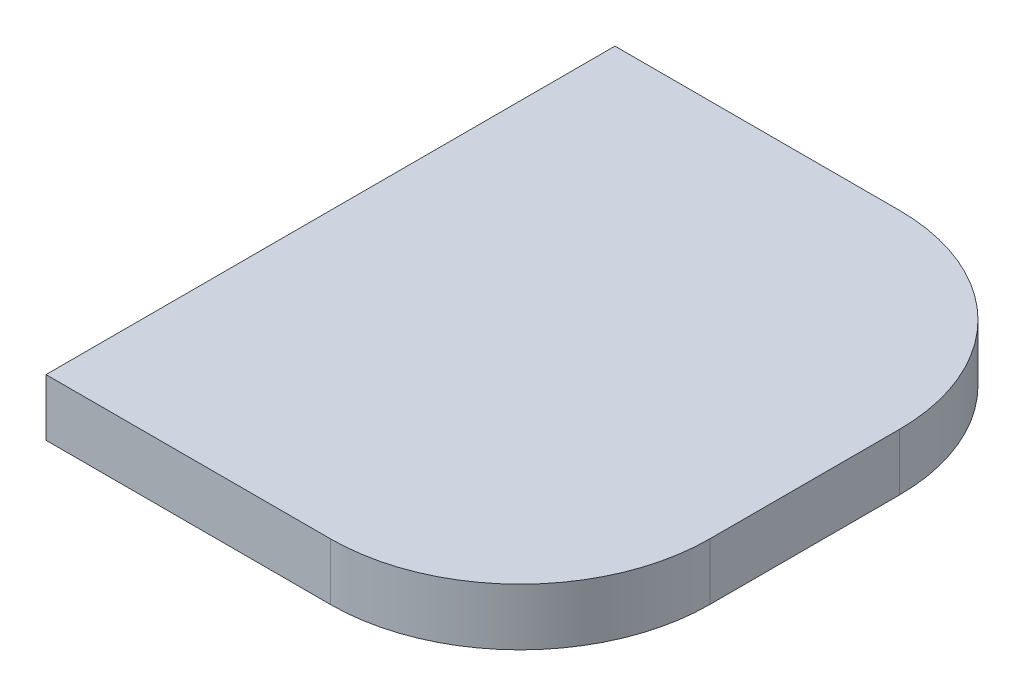
ISO-10303-21;
HEADER;
FILE_DESCRIPTION(('STEP AP214'),'2;1');
FILE_NAME('part.step','',(''),(''),'','','');
FILE_SCHEMA(('AUTOMOTIVE_DESIGN { 1 0 10303 214 1 1 1 1 }'));
ENDSEC;
DATA;
#1=APPLICATION_CONTEXT('core data for automotive mechanical design processes');
#2=APPLICATION_PROTOCOL_DEFINITION('international standard','automotive_design',2000,#1);
#3=PRODUCT_CONTEXT('',#1,'mechanical');
#4=PRODUCT('Part','Part','',(#3));
#5=PRODUCT_RELATED_PRODUCT_CATEGORY('part','',(#4));
#6=PRODUCT_DEFINITION_FORMATION('','',#4);
#7=PRODUCT_DEFINITION_CONTEXT('part definition',#1,'design');
#8=PRODUCT_DEFINITION('design','',#6,#7);
#9=PRODUCT_DEFINITION_SHAPE('','',#8);
#10=(LENGTH_UNIT() NAMED_UNIT(*) SI_UNIT(.MILLI.,.METRE.));
#11=(NAMED_UNIT(*) PLANE_ANGLE_UNIT() SI_UNIT($,.RADIAN.));
#12=(NAMED_UNIT(*) SI_UNIT($,.STERADIAN.) SOLID_ANGLE_UNIT());
#13=UNCERTAINTY_MEASURE_WITH_UNIT(LENGTH_MEASURE(1.E-05),#10,'distance_accuracy_value','');
#14=(GEOMETRIC_REPRESENTATION_CONTEXT(3) GLOBAL_UNCERTAINTY_ASSIGNED_CONTEXT((#13)) GLOBAL_UNIT_ASSIGNED_CONTEXT((#10,
#11,#12)) REPRESENTATION_CONTEXT('',''));
#15=CARTESIAN_POINT('',(0.,0.,0.));
#16=DIRECTION('',(0.,0.,1.));
#17=DIRECTION('',(1.,0.,0.));
#18=AXIS2_PLACEMENT_3D('',#15,#16,#17);
#19=CARTESIAN_POINT('',(-12.5,3.,15.));
#20=DIRECTION('',(1.,0.,0.));
#21=DIRECTION('',(0.,0.,-1.));
#22=AXIS2_PLACEMENT_3D('',#19,#20,#21);
#23=PLANE('',#22);
#24=DIRECTION('',(0.,0.,1.));
#25=VECTOR('',#24,1.);
#26=CARTESIAN_POINT('',(-12.5,0.,15.));
#27=LINE('',#26,#25);
#28=CARTESIAN_POINT('',(-12.5,0.,-15.));
#29=VERTEX_POINT('',#28);
#30=CARTESIAN_POINT('',(-12.5,0.,15.));
#31=VERTEX_POINT('',#30);
#32=EDGE_CURVE('E118',#29,#31,#27,.T.);
#33=ORIENTED_EDGE('',*,*,#32,.T.);
#34=DIRECTION('',(0.,-1.,0.));
#35=VECTOR('',#34,1.);
#36=CARTESIAN_POINT('',(-12.5,3.,15.));
#37=LINE('',#36,#35);
#38=CARTESIAN_POINT('',(-12.5,3.,15.));
#39=VERTEX_POINT('',#38);
#40=EDGE_CURVE('E11',#39,#31,#37,.T.);
#41=ORIENTED_EDGE('',*,*,#40,.F.);
#42=DIRECTION('',(0.,0.,1.));
#43=VECTOR('',#42,1.);
#44=CARTESIAN_POINT('',(-12.5,3.,15.));
#45=LINE('',#44,#43);
#46=CARTESIAN_POINT('',(-12.5,3.,-15.));
#47=VERTEX_POINT('',#46);
#48=EDGE_CURVE('E128',#47,#39,#45,.T.);
#49=ORIENTED_EDGE('',*,*,#48,.F.);
#50=DIRECTION('',(0.,-1.,0.));
#51=VECTOR('',#50,1.);
#52=CARTESIAN_POINT('',(-12.5,3.,-15.));
#53=LINE('',#52,#51);
#54=EDGE_CURVE('E114',#47,#29,#53,.T.);
#55=ORIENTED_EDGE('',*,*,#54,.T.);
#56=EDGE_LOOP('',(#33,#41,#49,#55));
#57=FACE_BOUND('',#56,.T.);
#58=ADVANCED_FACE('F34',(#57),#23,.F.);
#59=CARTESIAN_POINT('',(2.49999999999993,3.,15.));
#60=DIRECTION('',(0.,0.,-1.));
#61=DIRECTION('',(-1.,0.,0.));
#62=AXIS2_PLACEMENT_3D('',#59,#60,#61);
#63=PLANE('',#62);
#64=DIRECTION('',(1.,0.,0.));
#65=VECTOR('',#64,1.);
#66=CARTESIAN_POINT('',(2.49999999999993,0.,15.));
#67=LINE('',#66,#65);
#68=CARTESIAN_POINT('',(2.49999999999993,0.,15.));
#69=VERTEX_POINT('',#68);
#70=EDGE_CURVE('E121',#31,#69,#67,.T.);
#71=ORIENTED_EDGE('',*,*,#70,.T.);
#72=DIRECTION('',(0.,-1.,0.));
#73=VECTOR('',#72,1.);
#74=CARTESIAN_POINT('',(2.49999999999993,3.,15.));
#75=LINE('',#74,#73);
#76=CARTESIAN_POINT('',(2.49999999999993,3.,15.));
#77=VERTEX_POINT('',#76);
#78=EDGE_CURVE('E42',#77,#69,#75,.T.);
#79=ORIENTED_EDGE('',*,*,#78,.F.);
#80=DIRECTION('',(1.,0.,0.));
#81=VECTOR('',#80,1.);
#82=CARTESIAN_POINT('',(2.49999999999993,3.,15.));
#83=LINE('',#82,#81);
#84=EDGE_CURVE('E87',#39,#77,#83,.T.);
#85=ORIENTED_EDGE('',*,*,#84,.F.);
#86=ORIENTED_EDGE('',*,*,#40,.T.);
#87=EDGE_LOOP('',(#71,#79,#85,#86));
#88=FACE_BOUND('',#87,.T.);
#89=ADVANCED_FACE('F152',(#88),#63,.F.);
#90=CARTESIAN_POINT('',(2.5,3.,5.));
#91=DIRECTION('',(0.,-1.,0.));
#92=DIRECTION('',(0.,0.,-1.));
#93=AXIS2_PLACEMENT_3D('',#90,#91,#92);
#94=CYLINDRICAL_SURFACE('',#93,10.);
#95=CARTESIAN_POINT('',(2.5,0.,5.));
#96=DIRECTION('',(0.,1.,0.));
#97=DIRECTION('',(0.,0.,1.));
#98=AXIS2_PLACEMENT_3D('',#95,#96,#97);
#99=CIRCLE('',#98,10.);
#100=CARTESIAN_POINT('',(12.5,0.,4.99999999999993));
#101=VERTEX_POINT('',#100);
#102=EDGE_CURVE('E123',#69,#101,#99,.T.);
#103=ORIENTED_EDGE('',*,*,#102,.T.);
#104=DIRECTION('',(0.,-1.,0.));
#105=VECTOR('',#104,1.);
#106=CARTESIAN_POINT('',(12.5,3.,4.99999999999993));
#107=LINE('',#106,#105);
#108=CARTESIAN_POINT('',(12.5,3.,4.99999999999993));
#109=VERTEX_POINT('',#108);
#110=EDGE_CURVE('E109',#109,#101,#107,.T.);
#111=ORIENTED_EDGE('',*,*,#110,.F.);
#112=CARTESIAN_POINT('',(2.5,3.,5.));
#113=DIRECTION('',(0.,1.,0.));
#114=DIRECTION('',(0.,0.,1.));
#115=AXIS2_PLACEMENT_3D('',#112,#113,#114);
#116=CIRCLE('',#115,10.);
#117=EDGE_CURVE('E100',#77,#109,#116,.T.);
#118=ORIENTED_EDGE('',*,*,#117,.F.);
#119=ORIENTED_EDGE('',*,*,#78,.T.);
#120=EDGE_LOOP('',(#103,#111,#118,#119));
#121=FACE_BOUND('',#120,.T.);
#122=ADVANCED_FACE('F134',(#121),#94,.T.);
#123=CARTESIAN_POINT('',(12.5,3.,4.99999999999993));
#124=DIRECTION('',(-1.,0.,0.));
#125=DIRECTION('',(0.,0.,1.));
#126=AXIS2_PLACEMENT_3D('',#123,#124,#125);
#127=PLANE('',#126);
#128=DIRECTION('',(0.,0.,-1.));
#129=VECTOR('',#128,1.);
#130=CARTESIAN_POINT('',(12.5,0.,4.99999999999993));
#131=LINE('',#130,#129);
#132=CARTESIAN_POINT('',(12.5,0.,-4.99999999999993));
#133=VERTEX_POINT('',#132);
#134=EDGE_CURVE('E108',#101,#133,#131,.T.);
#135=ORIENTED_EDGE('',*,*,#134,.T.);
#136=DIRECTION('',(0.,-1.,0.));
#137=VECTOR('',#136,1.);
#138=CARTESIAN_POINT('',(12.5,3.,-4.99999999999993));
#139=LINE('',#138,#137);
#140=CARTESIAN_POINT('',(12.5,3.,-4.99999999999993));
#141=VERTEX_POINT('',#140);
#142=EDGE_CURVE('E105',#141,#133,#139,.T.);
#143=ORIENTED_EDGE('',*,*,#142,.F.);
#144=DIRECTION('',(0.,0.,-1.));
#145=VECTOR('',#144,1.);
#146=CARTESIAN_POINT('',(12.5,3.,4.99999999999993));
#147=LINE('',#146,#145);
#148=EDGE_CURVE('E94',#109,#141,#147,.T.);
#149=ORIENTED_EDGE('',*,*,#148,.F.);
#150=ORIENTED_EDGE('',*,*,#110,.T.);
#151=EDGE_LOOP('',(#135,#143,#149,#150));
#152=FACE_BOUND('',#151,.T.);
#153=ADVANCED_FACE('F106',(#152),#127,.F.);
#154=CARTESIAN_POINT('',(2.5,3.,-5.));
#155=DIRECTION('',(0.,-1.,0.));
#156=DIRECTION('',(0.,0.,-1.));
#157=AXIS2_PLACEMENT_3D('',#154,#155,#156);
#158=CYLINDRICAL_SURFACE('',#157,10.);
#159=CARTESIAN_POINT('',(2.5,0.,-5.));
#160=DIRECTION('',(0.,1.,0.));
#161=DIRECTION('',(0.,0.,1.));
#162=AXIS2_PLACEMENT_3D('',#159,#160,#161);
#163=CIRCLE('',#162,10.);
#164=CARTESIAN_POINT('',(2.49999999999993,0.,-15.));
#165=VERTEX_POINT('',#164);
#166=EDGE_CURVE('E73',#133,#165,#163,.T.);
#167=ORIENTED_EDGE('',*,*,#166,.T.);
#168=DIRECTION('',(0.,-1.,0.));
#169=VECTOR('',#168,1.);
#170=CARTESIAN_POINT('',(2.49999999999993,3.,-15.));
#171=LINE('',#170,#169);
#172=CARTESIAN_POINT('',(2.49999999999993,3.,-15.));
#173=VERTEX_POINT('',#172);
#174=EDGE_CURVE('E110',#173,#165,#171,.T.);
#175=ORIENTED_EDGE('',*,*,#174,.F.);
#176=CARTESIAN_POINT('',(2.5,3.,-5.));
#177=DIRECTION('',(0.,1.,0.));
#178=DIRECTION('',(0.,0.,1.));
#179=AXIS2_PLACEMENT_3D('',#176,#177,#178);
#180=CIRCLE('',#179,10.);
#181=EDGE_CURVE('E98',#141,#173,#180,.T.);
#182=ORIENTED_EDGE('',*,*,#181,.F.);
#183=ORIENTED_EDGE('',*,*,#142,.T.);
#184=EDGE_LOOP('',(#167,#175,#182,#183));
#185=FACE_BOUND('',#184,.T.);
#186=ADVANCED_FACE('F112',(#185),#158,.T.);
#187=CARTESIAN_POINT('',(2.49999999999993,3.,-15.));
#188=DIRECTION('',(0.,0.,1.));
#189=DIRECTION('',(1.,0.,0.));
#190=AXIS2_PLACEMENT_3D('',#187,#188,#189);
#191=PLANE('',#190);
#192=DIRECTION('',(-1.,0.,0.));
#193=VECTOR('',#192,1.);
#194=CARTESIAN_POINT('',(2.49999999999993,0.,-15.));
#195=LINE('',#194,#193);
#196=EDGE_CURVE('E79',#165,#29,#195,.T.);
#197=ORIENTED_EDGE('',*,*,#196,.T.);
#198=ORIENTED_EDGE('',*,*,#54,.F.);
#199=DIRECTION('',(-1.,0.,0.));
#200=VECTOR('',#199,1.);
#201=CARTESIAN_POINT('',(2.49999999999993,3.,-15.));
#202=LINE('',#201,#200);
#203=EDGE_CURVE('E50',#173,#47,#202,.T.);
#204=ORIENTED_EDGE('',*,*,#203,.F.);
#205=ORIENTED_EDGE('',*,*,#174,.T.);
#206=EDGE_LOOP('',(#197,#198,#204,#205));
#207=FACE_BOUND('',#206,.T.);
#208=ADVANCED_FACE('F141',(#207),#191,.F.);
#209=CARTESIAN_POINT('',(2.5,3.,-5.));
#210=DIRECTION('',(0.,1.,0.));
#211=DIRECTION('',(0.,0.,1.));
#212=AXIS2_PLACEMENT_3D('',#209,#210,#211);
#213=PLANE('',#212);
#214=ORIENTED_EDGE('',*,*,#48,.T.);
#215=ORIENTED_EDGE('',*,*,#84,.T.);
#216=ORIENTED_EDGE('',*,*,#117,.T.);
#217=ORIENTED_EDGE('',*,*,#148,.T.);
#218=ORIENTED_EDGE('',*,*,#181,.T.);
#219=ORIENTED_EDGE('',*,*,#203,.T.);
#220=EDGE_LOOP('',(#214,#215,#216,#217,#218,#219));
#221=FACE_BOUND('',#220,.T.);
#222=ADVANCED_FACE('F96',(#221),#213,.T.);
#223=CARTESIAN_POINT('',(2.5,0.,-5.));
#224=DIRECTION('',(0.,1.,0.));
#225=DIRECTION('',(0.,0.,1.));
#226=AXIS2_PLACEMENT_3D('',#223,#224,#225);
#227=PLANE('',#226);
#228=ORIENTED_EDGE('',*,*,#32,.F.);
#229=ORIENTED_EDGE('',*,*,#196,.F.);
#230=ORIENTED_EDGE('',*,*,#166,.F.);
#231=ORIENTED_EDGE('',*,*,#134,.F.);
#232=ORIENTED_EDGE('',*,*,#102,.F.);
#233=ORIENTED_EDGE('',*,*,#70,.F.);
#234=EDGE_LOOP('',(#228,#229,#230,#231,#232,#233));
#235=FACE_BOUND('',#234,.T.);
#236=ADVANCED_FACE('F137',(#235),#227,.F.);
#237=CLOSED_SHELL('',(#58,#89,#122,#153,#186,#208,#222,#236));
#238=MANIFOLD_SOLID_BREP('B2',#237);
#239=ADVANCED_BREP_SHAPE_REPRESENTATION('',(#18,#238),#14);
#240=SHAPE_DEFINITION_REPRESENTATION(#9,#239);
ENDSEC;
END-ISO-10303-21;
